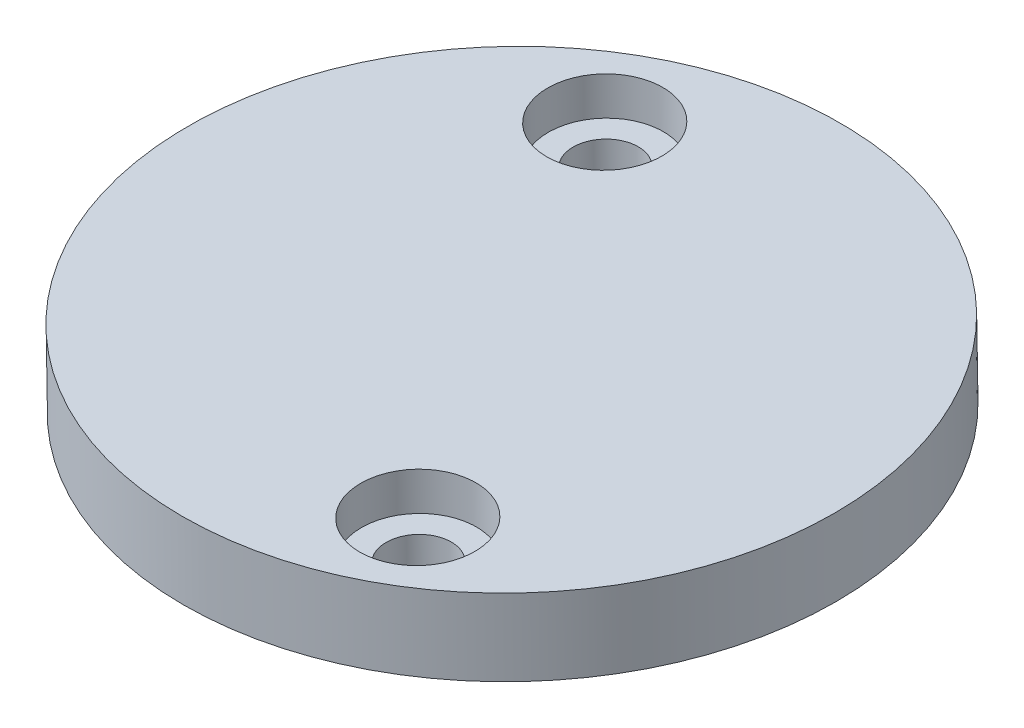
ISO-10303-21;
HEADER;
FILE_DESCRIPTION(('STEP AP214'),'2;1');
FILE_NAME('part.step','',(''),(''),'','','');
FILE_SCHEMA(('AUTOMOTIVE_DESIGN { 1 0 10303 214 1 1 1 1 }'));
ENDSEC;
DATA;
#1=APPLICATION_CONTEXT('core data for automotive mechanical design processes');
#2=APPLICATION_PROTOCOL_DEFINITION('international standard','automotive_design',2000,#1);
#3=PRODUCT_CONTEXT('',#1,'mechanical');
#4=PRODUCT('Part','Part','',(#3));
#5=PRODUCT_RELATED_PRODUCT_CATEGORY('part','',(#4));
#6=PRODUCT_DEFINITION_FORMATION('','',#4);
#7=PRODUCT_DEFINITION_CONTEXT('part definition',#1,'design');
#8=PRODUCT_DEFINITION('design','',#6,#7);
#9=PRODUCT_DEFINITION_SHAPE('','',#8);
#10=(LENGTH_UNIT() NAMED_UNIT(*) SI_UNIT(.MILLI.,.METRE.));
#11=(NAMED_UNIT(*) PLANE_ANGLE_UNIT() SI_UNIT($,.RADIAN.));
#12=(NAMED_UNIT(*) SI_UNIT($,.STERADIAN.) SOLID_ANGLE_UNIT());
#13=UNCERTAINTY_MEASURE_WITH_UNIT(LENGTH_MEASURE(1.E-05),#10,'distance_accuracy_value','');
#14=(GEOMETRIC_REPRESENTATION_CONTEXT(3) GLOBAL_UNCERTAINTY_ASSIGNED_CONTEXT((#13)) GLOBAL_UNIT_ASSIGNED_CONTEXT((#10,
#11,#12)) REPRESENTATION_CONTEXT('',''));
#15=CARTESIAN_POINT('',(0.,0.,0.));
#16=DIRECTION('',(0.,0.,1.));
#17=DIRECTION('',(1.,0.,0.));
#18=AXIS2_PLACEMENT_3D('',#15,#16,#17);
#19=CARTESIAN_POINT('',(116.081209803054,292.303069296196,219.395447944017));
#20=DIRECTION('',(0.,-0.999847695156391,-0.0174524064372833));
#21=DIRECTION('',(0.,0.0174524064372833,-0.999847695156391));
#22=AXIS2_PLACEMENT_3D('',#19,#20,#21);
#23=CYLINDRICAL_SURFACE('',#22,1.70000000000001);
#24=CARTESIAN_POINT('',(116.081209803054,288.30367851557,219.325638318267));
#25=DIRECTION('',(0.,0.999847695156391,0.0174524064372833));
#26=DIRECTION('',(0.,-0.0174524064372833,0.999847695156391));
#27=AXIS2_PLACEMENT_3D('',#24,#25,#26);
#28=CIRCLE('',#27,1.70000000000001);
#29=CARTESIAN_POINT('',(116.081209803054,288.274009424627,221.025379400033));
#30=VERTEX_POINT('',#29);
#31=EDGE_CURVE('E46',#30,#30,#28,.T.);
#32=ORIENTED_EDGE('',*,*,#31,.F.);
#33=EDGE_LOOP('',(#32));
#34=FACE_BOUND('',#33,.T.);
#35=CARTESIAN_POINT('',(116.081209803054,290.303373905883,219.360543131142));
#36=DIRECTION('',(0.,0.999847695156391,0.0174524064372833));
#37=DIRECTION('',(0.,-0.0174524064372833,0.999847695156391));
#38=AXIS2_PLACEMENT_3D('',#35,#36,#37);
#39=CIRCLE('',#38,1.70000000000003);
#40=CARTESIAN_POINT('',(116.081209803054,290.273704814939,221.060284212908));
#41=VERTEX_POINT('',#40);
#42=EDGE_CURVE('E63',#41,#41,#39,.T.);
#43=ORIENTED_EDGE('',*,*,#42,.T.);
#44=EDGE_LOOP('',(#43));
#45=FACE_BOUND('',#44,.T.);
#46=ADVANCED_FACE('F34',(#34,#45),#23,.F.);
#47=CARTESIAN_POINT('',(103.611961677805,292.689267766087,197.270152422084));
#48=DIRECTION('',(0.,-0.999847695156391,-0.0174524064372833));
#49=DIRECTION('',(0.,0.0174524064372833,-0.999847695156391));
#50=AXIS2_PLACEMENT_3D('',#47,#48,#49);
#51=CYLINDRICAL_SURFACE('',#50,1.7);
#52=CARTESIAN_POINT('',(103.611961677805,288.689876985461,197.200342796335));
#53=DIRECTION('',(0.,0.999847695156391,0.0174524064372833));
#54=DIRECTION('',(0.,-0.0174524064372833,0.999847695156391));
#55=AXIS2_PLACEMENT_3D('',#52,#53,#54);
#56=CIRCLE('',#55,1.7);
#57=CARTESIAN_POINT('',(103.611961677805,288.660207894518,198.900083878101));
#58=VERTEX_POINT('',#57);
#59=EDGE_CURVE('E51',#58,#58,#56,.T.);
#60=ORIENTED_EDGE('',*,*,#59,.F.);
#61=EDGE_LOOP('',(#60));
#62=FACE_BOUND('',#61,.T.);
#63=CARTESIAN_POINT('',(103.611961677805,290.689572375774,197.23524760921));
#64=DIRECTION('',(0.,0.999847695156391,0.0174524064372833));
#65=DIRECTION('',(0.,-0.0174524064372833,0.999847695156391));
#66=AXIS2_PLACEMENT_3D('',#63,#64,#65);
#67=CIRCLE('',#66,1.69999999999998);
#68=CARTESIAN_POINT('',(103.611961677805,290.659903284831,198.934988690975));
#69=VERTEX_POINT('',#68);
#70=EDGE_CURVE('E75',#69,#69,#67,.T.);
#71=ORIENTED_EDGE('',*,*,#70,.T.);
#72=EDGE_LOOP('',(#71));
#73=FACE_BOUND('',#72,.T.);
#74=ADVANCED_FACE('F36',(#62,#73),#51,.F.);
#75=CARTESIAN_POINT('',(109.84658574043,292.496168531141,208.33280018305));
#76=DIRECTION('',(0.,-0.999847695156391,-0.0174524064372833));
#77=DIRECTION('',(0.,0.0174524064372833,-0.999847695156391));
#78=AXIS2_PLACEMENT_3D('',#75,#76,#77);
#79=CYLINDRICAL_SURFACE('',#78,17.);
#80=CARTESIAN_POINT('',(109.84658574043,292.496168531141,208.33280018305));
#81=DIRECTION('',(0.,0.999847695156391,0.0174524064372833));
#82=DIRECTION('',(0.,-0.0174524064372833,0.999847695156391));
#83=AXIS2_PLACEMENT_3D('',#80,#81,#82);
#84=CIRCLE('',#83,17.);
#85=CARTESIAN_POINT('',(109.84658574043,292.199477621708,225.330211000709));
#86=VERTEX_POINT('',#85);
#87=EDGE_CURVE('E10',#86,#86,#84,.T.);
#88=ORIENTED_EDGE('',*,*,#87,.F.);
#89=EDGE_LOOP('',(#88));
#90=FACE_BOUND('',#89,.T.);
#91=CARTESIAN_POINT('',(109.84658574043,288.496777750516,208.262990557301));
#92=DIRECTION('',(0.,0.999847695156391,0.0174524064372833));
#93=DIRECTION('',(0.,-0.0174524064372833,0.999847695156391));
#94=AXIS2_PLACEMENT_3D('',#91,#92,#93);
#95=CIRCLE('',#94,17.);
#96=CARTESIAN_POINT('',(109.84658574043,288.200086841082,225.26040137496));
#97=VERTEX_POINT('',#96);
#98=EDGE_CURVE('E38',#97,#97,#95,.T.);
#99=ORIENTED_EDGE('',*,*,#98,.T.);
#100=EDGE_LOOP('',(#99));
#101=FACE_BOUND('',#100,.T.);
#102=ADVANCED_FACE('F110',(#90,#101),#79,.T.);
#103=CARTESIAN_POINT('',(0.,296.042433086203,5.16743989102711));
#104=DIRECTION('',(0.,0.999847695156391,0.0174524064372833));
#105=DIRECTION('',(0.,-0.0174524064372833,0.999847695156391));
#106=AXIS2_PLACEMENT_3D('',#103,#104,#105);
#107=PLANE('',#106);
#108=CARTESIAN_POINT('',(103.611961677805,292.689267766087,197.270152422084));
#109=DIRECTION('',(0.,0.999847695156391,0.0174524064372833));
#110=DIRECTION('',(0.,-0.0174524064372833,0.999847695156391));
#111=AXIS2_PLACEMENT_3D('',#108,#109,#110);
#112=CIRCLE('',#111,3.);
#113=CARTESIAN_POINT('',(103.611961677805,292.636910546775,200.269695507553));
#114=VERTEX_POINT('',#113);
#115=EDGE_CURVE('E72',#114,#114,#112,.T.);
#116=ORIENTED_EDGE('',*,*,#115,.F.);
#117=EDGE_LOOP('',(#116));
#118=FACE_BOUND('',#117,.T.);
#119=CARTESIAN_POINT('',(116.081209803054,292.303069296196,219.395447944017));
#120=DIRECTION('',(0.,0.999847695156391,0.0174524064372833));
#121=DIRECTION('',(0.,-0.0174524064372833,0.999847695156391));
#122=AXIS2_PLACEMENT_3D('',#119,#120,#121);
#123=CIRCLE('',#122,3.00000000000001);
#124=CARTESIAN_POINT('',(116.081209803054,292.250712076884,222.394991029486));
#125=VERTEX_POINT('',#124);
#126=EDGE_CURVE('E65',#125,#125,#123,.T.);
#127=ORIENTED_EDGE('',*,*,#126,.F.);
#128=EDGE_LOOP('',(#127));
#129=FACE_BOUND('',#128,.T.);
#130=ORIENTED_EDGE('',*,*,#87,.T.);
#131=EDGE_LOOP('',(#130));
#132=FACE_BOUND('',#131,.T.);
#133=ADVANCED_FACE('F107',(#118,#129,#132),#107,.T.);
#134=CARTESIAN_POINT('',(0.,292.043042305578,5.09763026527798));
#135=DIRECTION('',(0.,0.999847695156391,0.0174524064372833));
#136=DIRECTION('',(0.,-0.0174524064372833,0.999847695156391));
#137=AXIS2_PLACEMENT_3D('',#134,#135,#136);
#138=PLANE('',#137);
#139=ORIENTED_EDGE('',*,*,#59,.T.);
#140=EDGE_LOOP('',(#139));
#141=FACE_BOUND('',#140,.T.);
#142=ORIENTED_EDGE('',*,*,#31,.T.);
#143=EDGE_LOOP('',(#142));
#144=FACE_BOUND('',#143,.T.);
#145=CARTESIAN_POINT('',(98.7822528279696,288.387968557391,214.496665056483));
#146=DIRECTION('',(0.,0.999847695156391,0.0174524064372833));
#147=DIRECTION('',(0.,-0.0174524064372833,0.999847695156391));
#148=AXIS2_PLACEMENT_3D('',#145,#146,#147);
#149=CIRCLE('',#148,2.09999999999999);
#150=CARTESIAN_POINT('',(98.7822528279696,288.351318503873,216.596345216311));
#151=VERTEX_POINT('',#150);
#152=EDGE_CURVE('E49',#151,#151,#149,.T.);
#153=ORIENTED_EDGE('',*,*,#152,.T.);
#154=EDGE_LOOP('',(#153));
#155=FACE_BOUND('',#154,.T.);
#156=CARTESIAN_POINT('',(120.91091865289,288.60558694364,202.02931605812));
#157=DIRECTION('',(0.,0.999847695156391,0.0174524064372833));
#158=DIRECTION('',(0.,-0.0174524064372833,0.999847695156391));
#159=AXIS2_PLACEMENT_3D('',#156,#157,#158);
#160=CIRCLE('',#159,2.09999999999998);
#161=CARTESIAN_POINT('',(120.91091865289,288.568936890122,204.128996217948));
#162=VERTEX_POINT('',#161);
#163=EDGE_CURVE('E80',#162,#162,#160,.T.);
#164=ORIENTED_EDGE('',*,*,#163,.T.);
#165=EDGE_LOOP('',(#164));
#166=FACE_BOUND('',#165,.T.);
#167=ORIENTED_EDGE('',*,*,#98,.F.);
#168=EDGE_LOOP('',(#167));
#169=FACE_BOUND('',#168,.T.);
#170=ADVANCED_FACE('F56',(#141,#144,#155,#166,#169),#138,.F.);
#171=CARTESIAN_POINT('',(98.7822528279696,286.388273167078,214.461760243608));
#172=DIRECTION('',(0.,0.999847695156391,0.0174524064372833));
#173=DIRECTION('',(0.,-0.0174524064372833,0.999847695156391));
#174=AXIS2_PLACEMENT_3D('',#171,#172,#173);
#175=PLANE('',#174);
#176=CARTESIAN_POINT('',(98.7822528279696,286.388273167078,214.461760243608));
#177=DIRECTION('',(0.,0.999847695156391,0.0174524064372833));
#178=DIRECTION('',(0.,-0.0174524064372833,0.999847695156391));
#179=AXIS2_PLACEMENT_3D('',#176,#177,#178);
#180=CIRCLE('',#179,2.09999999999999);
#181=CARTESIAN_POINT('',(98.7822528279696,286.35162311356,216.561440403437));
#182=VERTEX_POINT('',#181);
#183=EDGE_CURVE('E83',#182,#182,#180,.T.);
#184=ORIENTED_EDGE('',*,*,#183,.F.);
#185=EDGE_LOOP('',(#184));
#186=FACE_BOUND('',#185,.T.);
#187=ADVANCED_FACE('F94',(#186),#175,.F.);
#188=CARTESIAN_POINT('',(98.7822528279696,286.388273167078,214.461760243608));
#189=DIRECTION('',(0.,0.999847695156391,0.0174524064372833));
#190=DIRECTION('',(0.,-0.0174524064372833,0.999847695156391));
#191=AXIS2_PLACEMENT_3D('',#188,#189,#190);
#192=CYLINDRICAL_SURFACE('',#191,2.09999999999999);
#193=ORIENTED_EDGE('',*,*,#183,.T.);
#194=EDGE_LOOP('',(#193));
#195=FACE_BOUND('',#194,.T.);
#196=ORIENTED_EDGE('',*,*,#152,.F.);
#197=EDGE_LOOP('',(#196));
#198=FACE_BOUND('',#197,.T.);
#199=ADVANCED_FACE('F91',(#195,#198),#192,.T.);
#200=CARTESIAN_POINT('',(120.91091865289,286.605891553328,201.994411245245));
#201=DIRECTION('',(0.,0.999847695156391,0.0174524064372833));
#202=DIRECTION('',(0.,-0.0174524064372833,0.999847695156391));
#203=AXIS2_PLACEMENT_3D('',#200,#201,#202);
#204=PLANE('',#203);
#205=CARTESIAN_POINT('',(120.91091865289,286.605891553328,201.994411245245));
#206=DIRECTION('',(0.,0.999847695156391,0.0174524064372833));
#207=DIRECTION('',(0.,-0.0174524064372833,0.999847695156391));
#208=AXIS2_PLACEMENT_3D('',#205,#206,#207);
#209=CIRCLE('',#208,2.09999999999998);
#210=CARTESIAN_POINT('',(120.91091865289,286.569241499809,204.094091405074));
#211=VERTEX_POINT('',#210);
#212=EDGE_CURVE('E77',#211,#211,#209,.T.);
#213=ORIENTED_EDGE('',*,*,#212,.F.);
#214=EDGE_LOOP('',(#213));
#215=FACE_BOUND('',#214,.T.);
#216=ADVANCED_FACE('F93',(#215),#204,.F.);
#217=CARTESIAN_POINT('',(120.91091865289,286.605891553328,201.994411245245));
#218=DIRECTION('',(0.,0.999847695156391,0.0174524064372833));
#219=DIRECTION('',(0.,-0.0174524064372833,0.999847695156391));
#220=AXIS2_PLACEMENT_3D('',#217,#218,#219);
#221=CYLINDRICAL_SURFACE('',#220,2.09999999999998);
#222=ORIENTED_EDGE('',*,*,#212,.T.);
#223=EDGE_LOOP('',(#222));
#224=FACE_BOUND('',#223,.T.);
#225=ORIENTED_EDGE('',*,*,#163,.F.);
#226=EDGE_LOOP('',(#225));
#227=FACE_BOUND('',#226,.T.);
#228=ADVANCED_FACE('F100',(#224,#227),#221,.T.);
#229=CARTESIAN_POINT('',(116.081209803054,290.303373905883,219.360543131142));
#230=DIRECTION('',(0.,0.999847695156391,0.0174524064372833));
#231=DIRECTION('',(0.,-0.0174524064372833,0.999847695156391));
#232=AXIS2_PLACEMENT_3D('',#229,#230,#231);
#233=CYLINDRICAL_SURFACE('',#232,3.00000000000001);
#234=CARTESIAN_POINT('',(116.081209803054,290.303373905883,219.360543131142));
#235=DIRECTION('',(0.,0.999847695156391,0.0174524064372833));
#236=DIRECTION('',(0.,-0.0174524064372833,0.999847695156391));
#237=AXIS2_PLACEMENT_3D('',#234,#235,#236);
#238=CIRCLE('',#237,3.00000000000001);
#239=CARTESIAN_POINT('',(116.081209803054,290.251016686571,222.360086216611));
#240=VERTEX_POINT('',#239);
#241=EDGE_CURVE('E68',#240,#240,#238,.T.);
#242=ORIENTED_EDGE('',*,*,#241,.F.);
#243=EDGE_LOOP('',(#242));
#244=FACE_BOUND('',#243,.T.);
#245=ORIENTED_EDGE('',*,*,#126,.T.);
#246=EDGE_LOOP('',(#245));
#247=FACE_BOUND('',#246,.T.);
#248=ADVANCED_FACE('F147',(#244,#247),#233,.F.);
#249=CARTESIAN_POINT('',(116.081209803054,290.303373905883,219.360543131142));
#250=DIRECTION('',(0.,0.999847695156391,0.0174524064372833));
#251=DIRECTION('',(0.,-0.0174524064372833,0.999847695156391));
#252=AXIS2_PLACEMENT_3D('',#249,#250,#251);
#253=PLANE('',#252);
#254=ORIENTED_EDGE('',*,*,#42,.F.);
#255=EDGE_LOOP('',(#254));
#256=FACE_BOUND('',#255,.T.);
#257=ORIENTED_EDGE('',*,*,#241,.T.);
#258=EDGE_LOOP('',(#257));
#259=FACE_BOUND('',#258,.T.);
#260=ADVANCED_FACE('F141',(#256,#259),#253,.T.);
#261=CARTESIAN_POINT('',(103.611961677805,290.689572375774,197.23524760921));
#262=DIRECTION('',(0.,0.999847695156391,0.0174524064372833));
#263=DIRECTION('',(0.,-0.0174524064372833,0.999847695156391));
#264=AXIS2_PLACEMENT_3D('',#261,#262,#263);
#265=CYLINDRICAL_SURFACE('',#264,3.);
#266=CARTESIAN_POINT('',(103.611961677805,290.689572375774,197.23524760921));
#267=DIRECTION('',(0.,0.999847695156391,0.0174524064372833));
#268=DIRECTION('',(0.,-0.0174524064372833,0.999847695156391));
#269=AXIS2_PLACEMENT_3D('',#266,#267,#268);
#270=CIRCLE('',#269,3.);
#271=CARTESIAN_POINT('',(103.611961677805,290.637215156462,200.234790694679));
#272=VERTEX_POINT('',#271);
#273=EDGE_CURVE('E81',#272,#272,#270,.T.);
#274=ORIENTED_EDGE('',*,*,#273,.F.);
#275=EDGE_LOOP('',(#274));
#276=FACE_BOUND('',#275,.T.);
#277=ORIENTED_EDGE('',*,*,#115,.T.);
#278=EDGE_LOOP('',(#277));
#279=FACE_BOUND('',#278,.T.);
#280=ADVANCED_FACE('F138',(#276,#279),#265,.F.);
#281=CARTESIAN_POINT('',(103.611961677805,290.689572375774,197.23524760921));
#282=DIRECTION('',(0.,0.999847695156391,0.0174524064372833));
#283=DIRECTION('',(0.,-0.0174524064372833,0.999847695156391));
#284=AXIS2_PLACEMENT_3D('',#281,#282,#283);
#285=PLANE('',#284);
#286=ORIENTED_EDGE('',*,*,#70,.F.);
#287=EDGE_LOOP('',(#286));
#288=FACE_BOUND('',#287,.T.);
#289=ORIENTED_EDGE('',*,*,#273,.T.);
#290=EDGE_LOOP('',(#289));
#291=FACE_BOUND('',#290,.T.);
#292=ADVANCED_FACE('F136',(#288,#291),#285,.T.);
#293=CLOSED_SHELL('',(#46,#74,#102,#133,#170,#187,#199,#216,#228,#248,#260,#280,#292));
#294=MANIFOLD_SOLID_BREP('B2',#293);
#295=ADVANCED_BREP_SHAPE_REPRESENTATION('',(#18,#294),#14);
#296=SHAPE_DEFINITION_REPRESENTATION(#9,#295);
ENDSEC;
END-ISO-10303-21;
